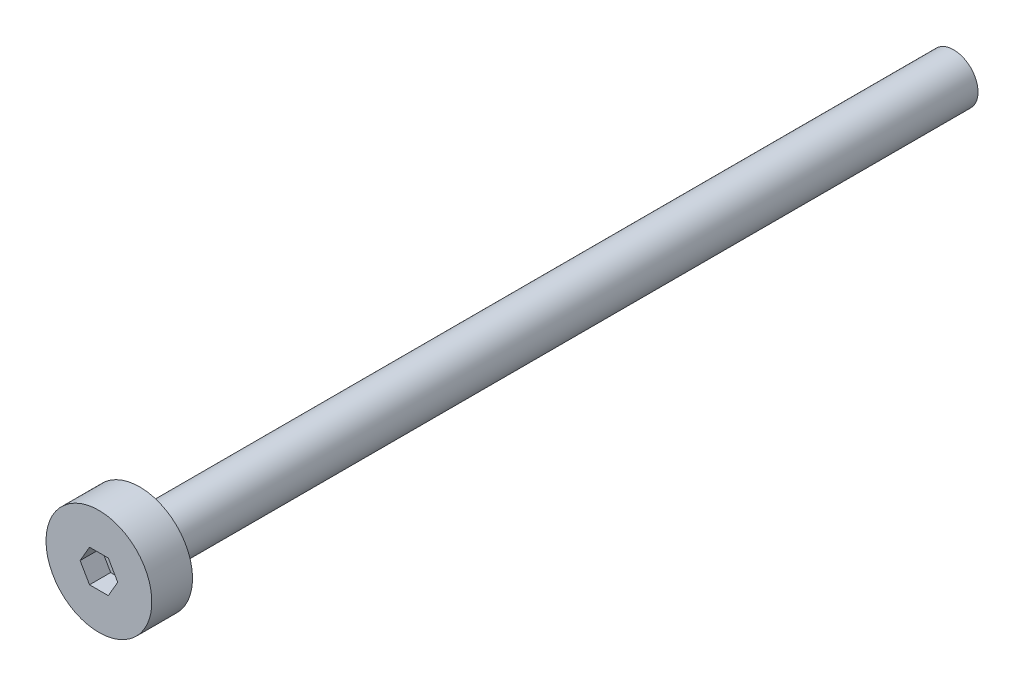
ISO-10303-21;
HEADER;
FILE_DESCRIPTION(('STEP AP214'),'2;1');
FILE_NAME('part.step','',(''),(''),'','','');
FILE_SCHEMA(('AUTOMOTIVE_DESIGN { 1 0 10303 214 1 1 1 1 }'));
ENDSEC;
DATA;
#1=APPLICATION_CONTEXT('core data for automotive mechanical design processes');
#2=APPLICATION_PROTOCOL_DEFINITION('international standard','automotive_design',2000,#1);
#3=PRODUCT_CONTEXT('',#1,'mechanical');
#4=PRODUCT('Part','Part','',(#3));
#5=PRODUCT_RELATED_PRODUCT_CATEGORY('part','',(#4));
#6=PRODUCT_DEFINITION_FORMATION('','',#4);
#7=PRODUCT_DEFINITION_CONTEXT('part definition',#1,'design');
#8=PRODUCT_DEFINITION('design','',#6,#7);
#9=PRODUCT_DEFINITION_SHAPE('','',#8);
#10=(LENGTH_UNIT() NAMED_UNIT(*) SI_UNIT(.MILLI.,.METRE.));
#11=(NAMED_UNIT(*) PLANE_ANGLE_UNIT() SI_UNIT($,.RADIAN.));
#12=(NAMED_UNIT(*) SI_UNIT($,.STERADIAN.) SOLID_ANGLE_UNIT());
#13=UNCERTAINTY_MEASURE_WITH_UNIT(LENGTH_MEASURE(1.E-05),#10,'distance_accuracy_value','');
#14=(GEOMETRIC_REPRESENTATION_CONTEXT(3) GLOBAL_UNCERTAINTY_ASSIGNED_CONTEXT((#13)) GLOBAL_UNIT_ASSIGNED_CONTEXT((#10,
#11,#12)) REPRESENTATION_CONTEXT('',''));
#15=CARTESIAN_POINT('',(0.,0.,0.));
#16=DIRECTION('',(0.,0.,1.));
#17=DIRECTION('',(1.,0.,0.));
#18=AXIS2_PLACEMENT_3D('',#15,#16,#17);
#19=CARTESIAN_POINT('',(0.,0.,1.2));
#20=DIRECTION('',(0.,0.,1.));
#21=DIRECTION('',(1.,0.,0.));
#22=AXIS2_PLACEMENT_3D('',#19,#20,#21);
#23=PLANE('',#22);
#24=DIRECTION('',(-0.50000000000019,0.866025403784329,0.));
#25=VECTOR('',#24,1.);
#26=CARTESIAN_POINT('',(1.154700538379,0.,1.2));
#27=LINE('',#26,#25);
#28=CARTESIAN_POINT('',(1.154700538379,0.,1.2));
#29=VERTEX_POINT('',#28);
#30=CARTESIAN_POINT('',(0.57735026919,1.,1.2));
#31=VERTEX_POINT('',#30);
#32=EDGE_CURVE('E9',#29,#31,#27,.T.);
#33=ORIENTED_EDGE('',*,*,#32,.T.);
#34=DIRECTION('',(-1.,0.,0.));
#35=VECTOR('',#34,1.);
#36=CARTESIAN_POINT('',(0.57735026919,1.,1.2));
#37=LINE('',#36,#35);
#38=CARTESIAN_POINT('',(-0.57735026919,1.,1.2));
#39=VERTEX_POINT('',#38);
#40=EDGE_CURVE('E96',#31,#39,#37,.T.);
#41=ORIENTED_EDGE('',*,*,#40,.T.);
#42=DIRECTION('',(-0.50000000000019,-0.866025403784329,0.));
#43=VECTOR('',#42,1.);
#44=CARTESIAN_POINT('',(-0.57735026919,1.,1.2));
#45=LINE('',#44,#43);
#46=CARTESIAN_POINT('',(-1.154700538379,0.,1.2));
#47=VERTEX_POINT('',#46);
#48=EDGE_CURVE('E90',#39,#47,#45,.T.);
#49=ORIENTED_EDGE('',*,*,#48,.T.);
#50=DIRECTION('',(0.50000000000019,-0.866025403784329,0.));
#51=VECTOR('',#50,1.);
#52=CARTESIAN_POINT('',(-1.154700538379,0.,1.2));
#53=LINE('',#52,#51);
#54=CARTESIAN_POINT('',(-0.57735026919,-1.,1.2));
#55=VERTEX_POINT('',#54);
#56=EDGE_CURVE('E93',#47,#55,#53,.T.);
#57=ORIENTED_EDGE('',*,*,#56,.T.);
#58=DIRECTION('',(1.,0.,0.));
#59=VECTOR('',#58,1.);
#60=CARTESIAN_POINT('',(-0.57735026919,-1.,1.2));
#61=LINE('',#60,#59);
#62=CARTESIAN_POINT('',(0.57735026919,-1.,1.2));
#63=VERTEX_POINT('',#62);
#64=EDGE_CURVE('E122',#55,#63,#61,.T.);
#65=ORIENTED_EDGE('',*,*,#64,.T.);
#66=DIRECTION('',(0.50000000000019,0.866025403784329,0.));
#67=VECTOR('',#66,1.);
#68=CARTESIAN_POINT('',(0.57735026919,-1.,1.2));
#69=LINE('',#68,#67);
#70=EDGE_CURVE('E140',#63,#29,#69,.T.);
#71=ORIENTED_EDGE('',*,*,#70,.T.);
#72=EDGE_LOOP('',(#33,#41,#49,#57,#65,#71));
#73=FACE_BOUND('',#72,.T.);
#74=ADVANCED_FACE('F14',(#73),#23,.T.);
#75=CARTESIAN_POINT('',(0.,0.,-50.));
#76=DIRECTION('',(0.,0.,-1.));
#77=DIRECTION('',(0.,-1.,0.));
#78=AXIS2_PLACEMENT_3D('',#75,#76,#77);
#79=PLANE('',#78);
#80=CARTESIAN_POINT('',(0.,0.,-50.));
#81=DIRECTION('',(0.,0.,-1.));
#82=DIRECTION('',(-1.,0.,0.));
#83=AXIS2_PLACEMENT_3D('',#80,#81,#82);
#84=CIRCLE('',#83,1.5);
#85=CARTESIAN_POINT('',(-1.5,0.,-50.));
#86=VERTEX_POINT('',#85);
#87=EDGE_CURVE('E130',#86,#86,#84,.T.);
#88=ORIENTED_EDGE('',*,*,#87,.T.);
#89=EDGE_LOOP('',(#88));
#90=FACE_BOUND('',#89,.T.);
#91=ADVANCED_FACE('F177',(#90),#79,.T.);
#92=CARTESIAN_POINT('',(1.154700538379,0.,1.2));
#93=DIRECTION('',(-0.866025403784329,-0.50000000000019,0.));
#94=DIRECTION('',(-0.50000000000019,0.866025403784329,0.));
#95=AXIS2_PLACEMENT_3D('',#92,#93,#94);
#96=PLANE('',#95);
#97=ORIENTED_EDGE('',*,*,#32,.F.);
#98=DIRECTION('',(0.,0.,1.));
#99=VECTOR('',#98,1.);
#100=CARTESIAN_POINT('',(1.154700538379,0.,1.2));
#101=LINE('',#100,#99);
#102=CARTESIAN_POINT('',(1.154700538379,0.,2.5));
#103=VERTEX_POINT('',#102);
#104=EDGE_CURVE('E146',#29,#103,#101,.T.);
#105=ORIENTED_EDGE('',*,*,#104,.T.);
#106=DIRECTION('',(-0.50000000000019,0.866025403784329,0.));
#107=VECTOR('',#106,1.);
#108=CARTESIAN_POINT('',(1.010362971082,0.25,2.5));
#109=LINE('',#108,#107);
#110=CARTESIAN_POINT('',(0.57735026919,1.,2.5));
#111=VERTEX_POINT('',#110);
#112=EDGE_CURVE('E131',#103,#111,#109,.T.);
#113=ORIENTED_EDGE('',*,*,#112,.T.);
#114=DIRECTION('',(0.,0.,1.));
#115=VECTOR('',#114,1.);
#116=CARTESIAN_POINT('',(0.57735026919,1.,1.2));
#117=LINE('',#116,#115);
#118=EDGE_CURVE('E25',#31,#111,#117,.T.);
#119=ORIENTED_EDGE('',*,*,#118,.F.);
#120=EDGE_LOOP('',(#97,#105,#113,#119));
#121=FACE_BOUND('',#120,.T.);
#122=ADVANCED_FACE('F220',(#121),#96,.T.);
#123=CARTESIAN_POINT('',(0.57735026919,1.,1.2));
#124=DIRECTION('',(0.,-1.,0.));
#125=DIRECTION('',(-1.,0.,0.));
#126=AXIS2_PLACEMENT_3D('',#123,#124,#125);
#127=PLANE('',#126);
#128=ORIENTED_EDGE('',*,*,#40,.F.);
#129=ORIENTED_EDGE('',*,*,#118,.T.);
#130=DIRECTION('',(-1.,0.,0.));
#131=VECTOR('',#130,1.);
#132=CARTESIAN_POINT('',(0.288675134595,1.,2.5));
#133=LINE('',#132,#131);
#134=CARTESIAN_POINT('',(-0.57735026919,1.,2.5));
#135=VERTEX_POINT('',#134);
#136=EDGE_CURVE('E18',#111,#135,#133,.T.);
#137=ORIENTED_EDGE('',*,*,#136,.T.);
#138=DIRECTION('',(0.,0.,1.));
#139=VECTOR('',#138,1.);
#140=CARTESIAN_POINT('',(-0.57735026919,1.,1.2));
#141=LINE('',#140,#139);
#142=EDGE_CURVE('E100',#39,#135,#141,.T.);
#143=ORIENTED_EDGE('',*,*,#142,.F.);
#144=EDGE_LOOP('',(#128,#129,#137,#143));
#145=FACE_BOUND('',#144,.T.);
#146=ADVANCED_FACE('F204',(#145),#127,.T.);
#147=CARTESIAN_POINT('',(-0.57735026919,1.,1.2));
#148=DIRECTION('',(0.866025403784329,-0.50000000000019,0.));
#149=DIRECTION('',(0.,0.,-1.));
#150=AXIS2_PLACEMENT_3D('',#147,#148,#149);
#151=PLANE('',#150);
#152=ORIENTED_EDGE('',*,*,#48,.F.);
#153=ORIENTED_EDGE('',*,*,#142,.T.);
#154=DIRECTION('',(-0.50000000000019,-0.866025403784329,0.));
#155=VECTOR('',#154,1.);
#156=CARTESIAN_POINT('',(-0.721687836487,0.75,2.5));
#157=LINE('',#156,#155);
#158=CARTESIAN_POINT('',(-1.154700538379,0.,2.5));
#159=VERTEX_POINT('',#158);
#160=EDGE_CURVE('E106',#135,#159,#157,.T.);
#161=ORIENTED_EDGE('',*,*,#160,.T.);
#162=DIRECTION('',(0.,0.,1.));
#163=VECTOR('',#162,1.);
#164=CARTESIAN_POINT('',(-1.154700538379,0.,1.2));
#165=LINE('',#164,#163);
#166=EDGE_CURVE('E101',#47,#159,#165,.T.);
#167=ORIENTED_EDGE('',*,*,#166,.F.);
#168=EDGE_LOOP('',(#152,#153,#161,#167));
#169=FACE_BOUND('',#168,.T.);
#170=ADVANCED_FACE('F16',(#169),#151,.T.);
#171=CARTESIAN_POINT('',(-1.154700538379,0.,1.2));
#172=DIRECTION('',(0.866025403784329,0.50000000000019,0.));
#173=DIRECTION('',(0.,0.,-1.));
#174=AXIS2_PLACEMENT_3D('',#171,#172,#173);
#175=PLANE('',#174);
#176=ORIENTED_EDGE('',*,*,#56,.F.);
#177=ORIENTED_EDGE('',*,*,#166,.T.);
#178=DIRECTION('',(0.50000000000019,-0.866025403784329,0.));
#179=VECTOR('',#178,1.);
#180=CARTESIAN_POINT('',(-1.010362971082,-0.25,2.5));
#181=LINE('',#180,#179);
#182=CARTESIAN_POINT('',(-0.57735026919,-1.,2.5));
#183=VERTEX_POINT('',#182);
#184=EDGE_CURVE('E150',#159,#183,#181,.T.);
#185=ORIENTED_EDGE('',*,*,#184,.T.);
#186=DIRECTION('',(0.,0.,1.));
#187=VECTOR('',#186,1.);
#188=CARTESIAN_POINT('',(-0.57735026919,-1.,1.2));
#189=LINE('',#188,#187);
#190=EDGE_CURVE('E114',#55,#183,#189,.T.);
#191=ORIENTED_EDGE('',*,*,#190,.F.);
#192=EDGE_LOOP('',(#176,#177,#185,#191));
#193=FACE_BOUND('',#192,.T.);
#194=ADVANCED_FACE('F112',(#193),#175,.T.);
#195=CARTESIAN_POINT('',(-0.57735026919,-1.,1.2));
#196=DIRECTION('',(0.,1.,0.));
#197=DIRECTION('',(1.,0.,0.));
#198=AXIS2_PLACEMENT_3D('',#195,#196,#197);
#199=PLANE('',#198);
#200=ORIENTED_EDGE('',*,*,#64,.F.);
#201=ORIENTED_EDGE('',*,*,#190,.T.);
#202=DIRECTION('',(1.,0.,0.));
#203=VECTOR('',#202,1.);
#204=CARTESIAN_POINT('',(-0.288675134595,-1.,2.5));
#205=LINE('',#204,#203);
#206=CARTESIAN_POINT('',(0.57735026919,-1.,2.5));
#207=VERTEX_POINT('',#206);
#208=EDGE_CURVE('E152',#183,#207,#205,.T.);
#209=ORIENTED_EDGE('',*,*,#208,.T.);
#210=DIRECTION('',(0.,0.,1.));
#211=VECTOR('',#210,1.);
#212=CARTESIAN_POINT('',(0.57735026919,-1.,1.2));
#213=LINE('',#212,#211);
#214=EDGE_CURVE('E143',#63,#207,#213,.T.);
#215=ORIENTED_EDGE('',*,*,#214,.F.);
#216=EDGE_LOOP('',(#200,#201,#209,#215));
#217=FACE_BOUND('',#216,.T.);
#218=ADVANCED_FACE('F213',(#217),#199,.T.);
#219=CARTESIAN_POINT('',(0.57735026919,-1.,1.2));
#220=DIRECTION('',(-0.866025403784329,0.50000000000019,0.));
#221=DIRECTION('',(0.,0.,1.));
#222=AXIS2_PLACEMENT_3D('',#219,#220,#221);
#223=PLANE('',#222);
#224=ORIENTED_EDGE('',*,*,#70,.F.);
#225=ORIENTED_EDGE('',*,*,#214,.T.);
#226=DIRECTION('',(0.50000000000019,0.866025403784329,0.));
#227=VECTOR('',#226,1.);
#228=CARTESIAN_POINT('',(0.721687836487,-0.75,2.5));
#229=LINE('',#228,#227);
#230=EDGE_CURVE('E127',#207,#103,#229,.T.);
#231=ORIENTED_EDGE('',*,*,#230,.T.);
#232=ORIENTED_EDGE('',*,*,#104,.F.);
#233=EDGE_LOOP('',(#224,#225,#231,#232));
#234=FACE_BOUND('',#233,.T.);
#235=ADVANCED_FACE('F218',(#234),#223,.T.);
#236=CARTESIAN_POINT('',(0.,0.,0.));
#237=DIRECTION('',(0.,0.,-1.));
#238=DIRECTION('',(-1.,0.,0.));
#239=AXIS2_PLACEMENT_3D('',#236,#237,#238);
#240=CYLINDRICAL_SURFACE('',#239,1.5);
#241=ORIENTED_EDGE('',*,*,#87,.F.);
#242=DIRECTION('',(0.,0.,-1.));
#243=VECTOR('',#242,1.);
#244=CARTESIAN_POINT('',(-1.5,0.,0.));
#245=LINE('',#244,#243);
#246=CARTESIAN_POINT('',(-1.5,0.,0.));
#247=VERTEX_POINT('',#246);
#248=EDGE_CURVE('E144',#247,#86,#245,.T.);
#249=ORIENTED_EDGE('',*,*,#248,.F.);
#250=CARTESIAN_POINT('',(0.,0.,0.));
#251=DIRECTION('',(0.,0.,-1.));
#252=DIRECTION('',(-1.,0.,0.));
#253=AXIS2_PLACEMENT_3D('',#250,#251,#252);
#254=CIRCLE('',#253,1.5);
#255=EDGE_CURVE('E154',#247,#247,#254,.T.);
#256=ORIENTED_EDGE('',*,*,#255,.T.);
#257=ORIENTED_EDGE('',*,*,#248,.T.);
#258=EDGE_LOOP('',(#241,#249,#256,#257));
#259=FACE_BOUND('',#258,.T.);
#260=ADVANCED_FACE('F179',(#259),#240,.T.);
#261=CARTESIAN_POINT('',(0.,0.,2.5));
#262=DIRECTION('',(0.,0.,-1.));
#263=DIRECTION('',(0.,-1.,0.));
#264=AXIS2_PLACEMENT_3D('',#261,#262,#263);
#265=PLANE('',#264);
#266=ORIENTED_EDGE('',*,*,#208,.F.);
#267=ORIENTED_EDGE('',*,*,#184,.F.);
#268=ORIENTED_EDGE('',*,*,#160,.F.);
#269=ORIENTED_EDGE('',*,*,#136,.F.);
#270=ORIENTED_EDGE('',*,*,#112,.F.);
#271=ORIENTED_EDGE('',*,*,#230,.F.);
#272=EDGE_LOOP('',(#266,#267,#268,#269,#270,#271));
#273=FACE_BOUND('',#272,.T.);
#274=CARTESIAN_POINT('',(0.,0.,2.5));
#275=DIRECTION('',(0.,0.,-1.));
#276=DIRECTION('',(-1.,0.,0.));
#277=AXIS2_PLACEMENT_3D('',#274,#275,#276);
#278=CIRCLE('',#277,3.25);
#279=CARTESIAN_POINT('',(-3.25,0.,2.5));
#280=VERTEX_POINT('',#279);
#281=EDGE_CURVE('E158',#280,#280,#278,.T.);
#282=ORIENTED_EDGE('',*,*,#281,.F.);
#283=EDGE_LOOP('',(#282));
#284=FACE_BOUND('',#283,.T.);
#285=ADVANCED_FACE('F186',(#273,#284),#265,.F.);
#286=CARTESIAN_POINT('',(0.,0.,0.));
#287=DIRECTION('',(0.,0.,-1.));
#288=DIRECTION('',(0.,-1.,0.));
#289=AXIS2_PLACEMENT_3D('',#286,#287,#288);
#290=PLANE('',#289);
#291=ORIENTED_EDGE('',*,*,#255,.F.);
#292=EDGE_LOOP('',(#291));
#293=FACE_BOUND('',#292,.T.);
#294=CARTESIAN_POINT('',(0.,0.,0.));
#295=DIRECTION('',(0.,0.,-1.));
#296=DIRECTION('',(-1.,0.,0.));
#297=AXIS2_PLACEMENT_3D('',#294,#295,#296);
#298=CIRCLE('',#297,3.25);
#299=CARTESIAN_POINT('',(-3.25,0.,0.));
#300=VERTEX_POINT('',#299);
#301=EDGE_CURVE('E132',#300,#300,#298,.T.);
#302=ORIENTED_EDGE('',*,*,#301,.T.);
#303=EDGE_LOOP('',(#302));
#304=FACE_BOUND('',#303,.T.);
#305=ADVANCED_FACE('F182',(#293,#304),#290,.T.);
#306=CARTESIAN_POINT('',(0.,0.,2.5));
#307=DIRECTION('',(0.,0.,-1.));
#308=DIRECTION('',(-1.,0.,0.));
#309=AXIS2_PLACEMENT_3D('',#306,#307,#308);
#310=CYLINDRICAL_SURFACE('',#309,3.25);
#311=ORIENTED_EDGE('',*,*,#301,.F.);
#312=DIRECTION('',(0.,0.,-1.));
#313=VECTOR('',#312,1.);
#314=CARTESIAN_POINT('',(-3.25,0.,2.5));
#315=LINE('',#314,#313);
#316=EDGE_CURVE('E136',#280,#300,#315,.T.);
#317=ORIENTED_EDGE('',*,*,#316,.F.);
#318=ORIENTED_EDGE('',*,*,#281,.T.);
#319=ORIENTED_EDGE('',*,*,#316,.T.);
#320=EDGE_LOOP('',(#311,#317,#318,#319));
#321=FACE_BOUND('',#320,.T.);
#322=ADVANCED_FACE('F185',(#321),#310,.T.);
#323=CLOSED_SHELL('',(#74,#91,#122,#146,#170,#194,#218,#235,#260,#285,#305,#322));
#324=MANIFOLD_SOLID_BREP('B1',#323);
#325=ADVANCED_BREP_SHAPE_REPRESENTATION('',(#18,#324),#14);
#326=SHAPE_DEFINITION_REPRESENTATION(#9,#325);
ENDSEC;
END-ISO-10303-21;
